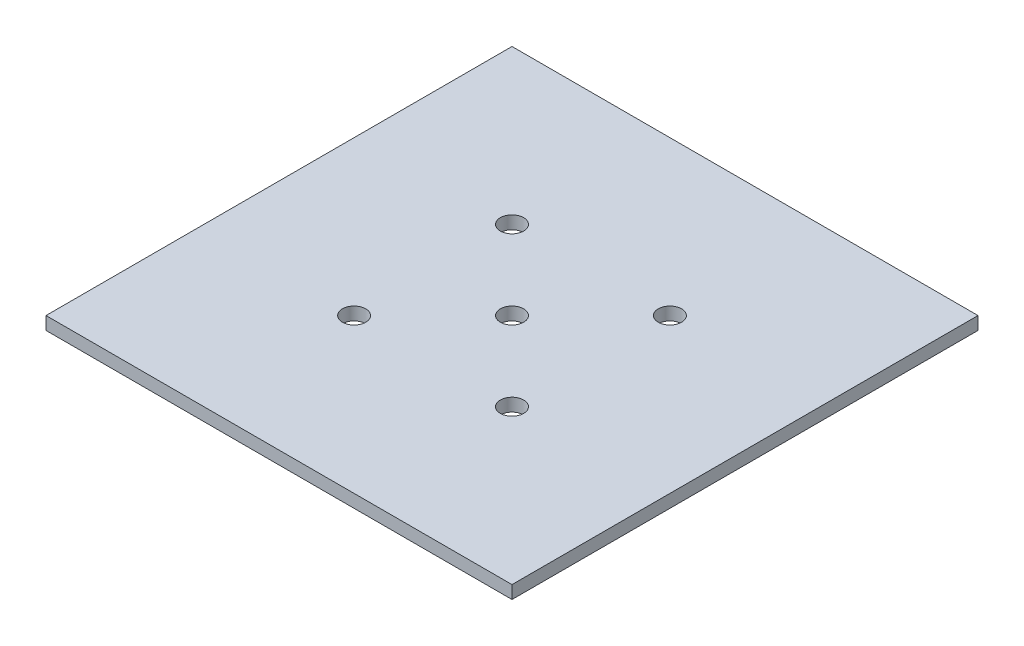
ISO-10303-21;
HEADER;
FILE_DESCRIPTION(('STEP AP214'),'2;1');
FILE_NAME('part.step','',(''),(''),'','','');
FILE_SCHEMA(('AUTOMOTIVE_DESIGN { 1 0 10303 214 1 1 1 1 }'));
ENDSEC;
DATA;
#1=APPLICATION_CONTEXT('core data for automotive mechanical design processes');
#2=APPLICATION_PROTOCOL_DEFINITION('international standard','automotive_design',2000,#1);
#3=PRODUCT_CONTEXT('',#1,'mechanical');
#4=PRODUCT('Part','Part','',(#3));
#5=PRODUCT_RELATED_PRODUCT_CATEGORY('part','',(#4));
#6=PRODUCT_DEFINITION_FORMATION('','',#4);
#7=PRODUCT_DEFINITION_CONTEXT('part definition',#1,'design');
#8=PRODUCT_DEFINITION('design','',#6,#7);
#9=PRODUCT_DEFINITION_SHAPE('','',#8);
#10=(LENGTH_UNIT() NAMED_UNIT(*) SI_UNIT(.MILLI.,.METRE.));
#11=(NAMED_UNIT(*) PLANE_ANGLE_UNIT() SI_UNIT($,.RADIAN.));
#12=(NAMED_UNIT(*) SI_UNIT($,.STERADIAN.) SOLID_ANGLE_UNIT());
#13=UNCERTAINTY_MEASURE_WITH_UNIT(LENGTH_MEASURE(1.E-05),#10,'distance_accuracy_value','');
#14=(GEOMETRIC_REPRESENTATION_CONTEXT(3) GLOBAL_UNCERTAINTY_ASSIGNED_CONTEXT((#13)) GLOBAL_UNIT_ASSIGNED_CONTEXT((#10,
#11,#12)) REPRESENTATION_CONTEXT('',''));
#15=CARTESIAN_POINT('',(0.,0.,0.));
#16=DIRECTION('',(0.,0.,1.));
#17=DIRECTION('',(1.,0.,0.));
#18=AXIS2_PLACEMENT_3D('',#15,#16,#17);
#19=CARTESIAN_POINT('',(45.,1.25,-45.));
#20=DIRECTION('',(-1.,0.,0.));
#21=DIRECTION('',(0.,0.,1.));
#22=AXIS2_PLACEMENT_3D('',#19,#20,#21);
#23=PLANE('',#22);
#24=DIRECTION('',(0.,0.,-1.));
#25=VECTOR('',#24,1.);
#26=CARTESIAN_POINT('',(45.,-1.25,-45.));
#27=LINE('',#26,#25);
#28=CARTESIAN_POINT('',(45.,-1.25,45.));
#29=VERTEX_POINT('',#28);
#30=CARTESIAN_POINT('',(45.,-1.25,-45.));
#31=VERTEX_POINT('',#30);
#32=EDGE_CURVE('E114',#29,#31,#27,.T.);
#33=ORIENTED_EDGE('',*,*,#32,.T.);
#34=DIRECTION('',(0.,-1.,0.));
#35=VECTOR('',#34,1.);
#36=CARTESIAN_POINT('',(45.,1.25,-45.));
#37=LINE('',#36,#35);
#38=CARTESIAN_POINT('',(45.,1.25,-45.));
#39=VERTEX_POINT('',#38);
#40=EDGE_CURVE('E11',#39,#31,#37,.T.);
#41=ORIENTED_EDGE('',*,*,#40,.F.);
#42=DIRECTION('',(0.,0.,-1.));
#43=VECTOR('',#42,1.);
#44=CARTESIAN_POINT('',(45.,1.25,-45.));
#45=LINE('',#44,#43);
#46=CARTESIAN_POINT('',(45.,1.25,45.));
#47=VERTEX_POINT('',#46);
#48=EDGE_CURVE('E97',#47,#39,#45,.T.);
#49=ORIENTED_EDGE('',*,*,#48,.F.);
#50=DIRECTION('',(0.,-1.,0.));
#51=VECTOR('',#50,1.);
#52=CARTESIAN_POINT('',(45.,1.25,45.));
#53=LINE('',#52,#51);
#54=EDGE_CURVE('E110',#47,#29,#53,.T.);
#55=ORIENTED_EDGE('',*,*,#54,.T.);
#56=EDGE_LOOP('',(#33,#41,#49,#55));
#57=FACE_BOUND('',#56,.T.);
#58=ADVANCED_FACE('F43',(#57),#23,.F.);
#59=CARTESIAN_POINT('',(-45.,1.25,-45.));
#60=DIRECTION('',(0.,0.,1.));
#61=DIRECTION('',(1.,0.,0.));
#62=AXIS2_PLACEMENT_3D('',#59,#60,#61);
#63=PLANE('',#62);
#64=DIRECTION('',(-1.,0.,0.));
#65=VECTOR('',#64,1.);
#66=CARTESIAN_POINT('',(-45.,-1.25,-45.));
#67=LINE('',#66,#65);
#68=CARTESIAN_POINT('',(-45.,-1.25,-45.));
#69=VERTEX_POINT('',#68);
#70=EDGE_CURVE('E102',#31,#69,#67,.T.);
#71=ORIENTED_EDGE('',*,*,#70,.T.);
#72=DIRECTION('',(0.,-1.,0.));
#73=VECTOR('',#72,1.);
#74=CARTESIAN_POINT('',(-45.,1.25,-45.));
#75=LINE('',#74,#73);
#76=CARTESIAN_POINT('',(-45.,1.25,-45.));
#77=VERTEX_POINT('',#76);
#78=EDGE_CURVE('E53',#77,#69,#75,.T.);
#79=ORIENTED_EDGE('',*,*,#78,.F.);
#80=DIRECTION('',(-1.,0.,0.));
#81=VECTOR('',#80,1.);
#82=CARTESIAN_POINT('',(-45.,1.25,-45.));
#83=LINE('',#82,#81);
#84=EDGE_CURVE('E92',#39,#77,#83,.T.);
#85=ORIENTED_EDGE('',*,*,#84,.F.);
#86=ORIENTED_EDGE('',*,*,#40,.T.);
#87=EDGE_LOOP('',(#71,#79,#85,#86));
#88=FACE_BOUND('',#87,.T.);
#89=ADVANCED_FACE('F101',(#88),#63,.F.);
#90=CARTESIAN_POINT('',(-45.,1.25,-45.));
#91=DIRECTION('',(1.,0.,0.));
#92=DIRECTION('',(0.,0.,-1.));
#93=AXIS2_PLACEMENT_3D('',#90,#91,#92);
#94=PLANE('',#93);
#95=DIRECTION('',(0.,0.,1.));
#96=VECTOR('',#95,1.);
#97=CARTESIAN_POINT('',(-45.,-1.25,-45.));
#98=LINE('',#97,#96);
#99=CARTESIAN_POINT('',(-45.,-1.25,45.));
#100=VERTEX_POINT('',#99);
#101=EDGE_CURVE('E79',#69,#100,#98,.T.);
#102=ORIENTED_EDGE('',*,*,#101,.T.);
#103=DIRECTION('',(0.,-1.,0.));
#104=VECTOR('',#103,1.);
#105=CARTESIAN_POINT('',(-45.,1.25,45.));
#106=LINE('',#105,#104);
#107=CARTESIAN_POINT('',(-45.,1.25,45.));
#108=VERTEX_POINT('',#107);
#109=EDGE_CURVE('E104',#108,#100,#106,.T.);
#110=ORIENTED_EDGE('',*,*,#109,.F.);
#111=DIRECTION('',(0.,0.,1.));
#112=VECTOR('',#111,1.);
#113=CARTESIAN_POINT('',(-45.,1.25,-45.));
#114=LINE('',#113,#112);
#115=EDGE_CURVE('E95',#77,#108,#114,.T.);
#116=ORIENTED_EDGE('',*,*,#115,.F.);
#117=ORIENTED_EDGE('',*,*,#78,.T.);
#118=EDGE_LOOP('',(#102,#110,#116,#117));
#119=FACE_BOUND('',#118,.T.);
#120=ADVANCED_FACE('F106',(#119),#94,.F.);
#121=CARTESIAN_POINT('',(-45.,1.25,45.));
#122=DIRECTION('',(0.,0.,-1.));
#123=DIRECTION('',(-1.,0.,0.));
#124=AXIS2_PLACEMENT_3D('',#121,#122,#123);
#125=PLANE('',#124);
#126=DIRECTION('',(1.,0.,0.));
#127=VECTOR('',#126,1.);
#128=CARTESIAN_POINT('',(-45.,-1.25,45.));
#129=LINE('',#128,#127);
#130=EDGE_CURVE('E85',#100,#29,#129,.T.);
#131=ORIENTED_EDGE('',*,*,#130,.T.);
#132=ORIENTED_EDGE('',*,*,#54,.F.);
#133=DIRECTION('',(1.,0.,0.));
#134=VECTOR('',#133,1.);
#135=CARTESIAN_POINT('',(-45.,1.25,45.));
#136=LINE('',#135,#134);
#137=EDGE_CURVE('E62',#108,#47,#136,.T.);
#138=ORIENTED_EDGE('',*,*,#137,.F.);
#139=ORIENTED_EDGE('',*,*,#109,.T.);
#140=EDGE_LOOP('',(#131,#132,#138,#139));
#141=FACE_BOUND('',#140,.T.);
#142=ADVANCED_FACE('F174',(#141),#125,.F.);
#143=CARTESIAN_POINT('',(0.,1.25,0.));
#144=DIRECTION('',(0.,1.,0.));
#145=DIRECTION('',(0.,0.,1.));
#146=AXIS2_PLACEMENT_3D('',#143,#144,#145);
#147=PLANE('',#146);
#148=CARTESIAN_POINT('',(0.,1.25,0.));
#149=DIRECTION('',(0.,1.,0.));
#150=DIRECTION('',(0.,0.,1.));
#151=AXIS2_PLACEMENT_3D('',#148,#149,#150);
#152=CIRCLE('',#151,2.24999999999999);
#153=CARTESIAN_POINT('',(0.,1.25,2.24999999999999));
#154=VERTEX_POINT('',#153);
#155=EDGE_CURVE('E158',#154,#154,#152,.T.);
#156=ORIENTED_EDGE('',*,*,#155,.F.);
#157=EDGE_LOOP('',(#156));
#158=FACE_BOUND('',#157,.T.);
#159=CARTESIAN_POINT('',(15.25,1.25,-15.25));
#160=DIRECTION('',(0.,1.,0.));
#161=DIRECTION('',(0.,0.,1.));
#162=AXIS2_PLACEMENT_3D('',#159,#160,#161);
#163=CIRCLE('',#162,2.24999999999999);
#164=CARTESIAN_POINT('',(15.25,1.25,-13.));
#165=VERTEX_POINT('',#164);
#166=EDGE_CURVE('E145',#165,#165,#163,.T.);
#167=ORIENTED_EDGE('',*,*,#166,.F.);
#168=EDGE_LOOP('',(#167));
#169=FACE_BOUND('',#168,.T.);
#170=CARTESIAN_POINT('',(-15.25,1.25,15.25));
#171=DIRECTION('',(0.,1.,0.));
#172=DIRECTION('',(0.,0.,1.));
#173=AXIS2_PLACEMENT_3D('',#170,#171,#172);
#174=CIRCLE('',#173,2.24999999999999);
#175=CARTESIAN_POINT('',(-15.25,1.25,17.5));
#176=VERTEX_POINT('',#175);
#177=EDGE_CURVE('E141',#176,#176,#174,.T.);
#178=ORIENTED_EDGE('',*,*,#177,.F.);
#179=EDGE_LOOP('',(#178));
#180=FACE_BOUND('',#179,.T.);
#181=CARTESIAN_POINT('',(-15.25,1.25,-15.25));
#182=DIRECTION('',(0.,1.,0.));
#183=DIRECTION('',(0.,0.,1.));
#184=AXIS2_PLACEMENT_3D('',#181,#182,#183);
#185=CIRCLE('',#184,2.24999999999999);
#186=CARTESIAN_POINT('',(-15.25,1.25,-13.));
#187=VERTEX_POINT('',#186);
#188=EDGE_CURVE('E137',#187,#187,#185,.T.);
#189=ORIENTED_EDGE('',*,*,#188,.F.);
#190=EDGE_LOOP('',(#189));
#191=FACE_BOUND('',#190,.T.);
#192=CARTESIAN_POINT('',(15.25,1.25,15.25));
#193=DIRECTION('',(0.,1.,0.));
#194=DIRECTION('',(0.,0.,1.));
#195=AXIS2_PLACEMENT_3D('',#192,#193,#194);
#196=CIRCLE('',#195,2.24999999999999);
#197=CARTESIAN_POINT('',(15.25,1.25,17.5));
#198=VERTEX_POINT('',#197);
#199=EDGE_CURVE('E132',#198,#198,#196,.T.);
#200=ORIENTED_EDGE('',*,*,#199,.F.);
#201=EDGE_LOOP('',(#200));
#202=FACE_BOUND('',#201,.T.);
#203=ORIENTED_EDGE('',*,*,#48,.T.);
#204=ORIENTED_EDGE('',*,*,#84,.T.);
#205=ORIENTED_EDGE('',*,*,#115,.T.);
#206=ORIENTED_EDGE('',*,*,#137,.T.);
#207=EDGE_LOOP('',(#203,#204,#205,#206));
#208=FACE_BOUND('',#207,.T.);
#209=ADVANCED_FACE('F93',(#158,#169,#180,#191,#202,#208),#147,.T.);
#210=CARTESIAN_POINT('',(0.,-1.25,0.));
#211=DIRECTION('',(0.,1.,0.));
#212=DIRECTION('',(0.,0.,1.));
#213=AXIS2_PLACEMENT_3D('',#210,#211,#212);
#214=PLANE('',#213);
#215=CARTESIAN_POINT('',(0.,-1.25,0.));
#216=DIRECTION('',(0.,1.,0.));
#217=DIRECTION('',(0.,0.,1.));
#218=AXIS2_PLACEMENT_3D('',#215,#216,#217);
#219=CIRCLE('',#218,2.24999999999999);
#220=CARTESIAN_POINT('',(0.,-1.25,2.24999999999999));
#221=VERTEX_POINT('',#220);
#222=EDGE_CURVE('E46',#221,#221,#219,.T.);
#223=ORIENTED_EDGE('',*,*,#222,.T.);
#224=EDGE_LOOP('',(#223));
#225=FACE_BOUND('',#224,.T.);
#226=CARTESIAN_POINT('',(15.25,-1.25,-15.25));
#227=DIRECTION('',(0.,1.,0.));
#228=DIRECTION('',(0.,0.,1.));
#229=AXIS2_PLACEMENT_3D('',#226,#227,#228);
#230=CIRCLE('',#229,2.24999999999999);
#231=CARTESIAN_POINT('',(15.25,-1.25,-13.));
#232=VERTEX_POINT('',#231);
#233=EDGE_CURVE('E142',#232,#232,#230,.T.);
#234=ORIENTED_EDGE('',*,*,#233,.T.);
#235=EDGE_LOOP('',(#234));
#236=FACE_BOUND('',#235,.T.);
#237=CARTESIAN_POINT('',(-15.25,-1.25,15.25));
#238=DIRECTION('',(0.,1.,0.));
#239=DIRECTION('',(0.,0.,1.));
#240=AXIS2_PLACEMENT_3D('',#237,#238,#239);
#241=CIRCLE('',#240,2.24999999999999);
#242=CARTESIAN_POINT('',(-15.25,-1.25,17.5));
#243=VERTEX_POINT('',#242);
#244=EDGE_CURVE('E138',#243,#243,#241,.T.);
#245=ORIENTED_EDGE('',*,*,#244,.T.);
#246=EDGE_LOOP('',(#245));
#247=FACE_BOUND('',#246,.T.);
#248=CARTESIAN_POINT('',(-15.25,-1.25,-15.25));
#249=DIRECTION('',(0.,1.,0.));
#250=DIRECTION('',(0.,0.,1.));
#251=AXIS2_PLACEMENT_3D('',#248,#249,#250);
#252=CIRCLE('',#251,2.24999999999999);
#253=CARTESIAN_POINT('',(-15.25,-1.25,-13.));
#254=VERTEX_POINT('',#253);
#255=EDGE_CURVE('E133',#254,#254,#252,.T.);
#256=ORIENTED_EDGE('',*,*,#255,.T.);
#257=EDGE_LOOP('',(#256));
#258=FACE_BOUND('',#257,.T.);
#259=CARTESIAN_POINT('',(15.25,-1.25,15.25));
#260=DIRECTION('',(0.,1.,0.));
#261=DIRECTION('',(0.,0.,1.));
#262=AXIS2_PLACEMENT_3D('',#259,#260,#261);
#263=CIRCLE('',#262,2.24999999999999);
#264=CARTESIAN_POINT('',(15.25,-1.25,17.5));
#265=VERTEX_POINT('',#264);
#266=EDGE_CURVE('E118',#265,#265,#263,.T.);
#267=ORIENTED_EDGE('',*,*,#266,.T.);
#268=EDGE_LOOP('',(#267));
#269=FACE_BOUND('',#268,.T.);
#270=ORIENTED_EDGE('',*,*,#32,.F.);
#271=ORIENTED_EDGE('',*,*,#130,.F.);
#272=ORIENTED_EDGE('',*,*,#101,.F.);
#273=ORIENTED_EDGE('',*,*,#70,.F.);
#274=EDGE_LOOP('',(#270,#271,#272,#273));
#275=FACE_BOUND('',#274,.T.);
#276=ADVANCED_FACE('F173',(#225,#236,#247,#258,#269,#275),#214,.F.);
#277=CARTESIAN_POINT('',(15.25,1.25,15.25));
#278=DIRECTION('',(0.,1.,0.));
#279=DIRECTION('',(0.,0.,1.));
#280=AXIS2_PLACEMENT_3D('',#277,#278,#279);
#281=CYLINDRICAL_SURFACE('',#280,2.24999999999999);
#282=ORIENTED_EDGE('',*,*,#199,.T.);
#283=EDGE_LOOP('',(#282));
#284=FACE_BOUND('',#283,.T.);
#285=ORIENTED_EDGE('',*,*,#266,.F.);
#286=EDGE_LOOP('',(#285));
#287=FACE_BOUND('',#286,.T.);
#288=ADVANCED_FACE('F169',(#284,#287),#281,.F.);
#289=CARTESIAN_POINT('',(-15.25,1.25,-15.25));
#290=DIRECTION('',(0.,1.,0.));
#291=DIRECTION('',(0.,0.,1.));
#292=AXIS2_PLACEMENT_3D('',#289,#290,#291);
#293=CYLINDRICAL_SURFACE('',#292,2.24999999999999);
#294=ORIENTED_EDGE('',*,*,#188,.T.);
#295=EDGE_LOOP('',(#294));
#296=FACE_BOUND('',#295,.T.);
#297=ORIENTED_EDGE('',*,*,#255,.F.);
#298=EDGE_LOOP('',(#297));
#299=FACE_BOUND('',#298,.T.);
#300=ADVANCED_FACE('F223',(#296,#299),#293,.F.);
#301=CARTESIAN_POINT('',(-15.25,1.25,15.25));
#302=DIRECTION('',(0.,1.,0.));
#303=DIRECTION('',(0.,0.,1.));
#304=AXIS2_PLACEMENT_3D('',#301,#302,#303);
#305=CYLINDRICAL_SURFACE('',#304,2.24999999999999);
#306=ORIENTED_EDGE('',*,*,#177,.T.);
#307=EDGE_LOOP('',(#306));
#308=FACE_BOUND('',#307,.T.);
#309=ORIENTED_EDGE('',*,*,#244,.F.);
#310=EDGE_LOOP('',(#309));
#311=FACE_BOUND('',#310,.T.);
#312=ADVANCED_FACE('F228',(#308,#311),#305,.F.);
#313=CARTESIAN_POINT('',(15.25,1.25,-15.25));
#314=DIRECTION('',(0.,1.,0.));
#315=DIRECTION('',(0.,0.,1.));
#316=AXIS2_PLACEMENT_3D('',#313,#314,#315);
#317=CYLINDRICAL_SURFACE('',#316,2.24999999999999);
#318=ORIENTED_EDGE('',*,*,#166,.T.);
#319=EDGE_LOOP('',(#318));
#320=FACE_BOUND('',#319,.T.);
#321=ORIENTED_EDGE('',*,*,#233,.F.);
#322=EDGE_LOOP('',(#321));
#323=FACE_BOUND('',#322,.T.);
#324=ADVANCED_FACE('F236',(#320,#323),#317,.F.);
#325=CARTESIAN_POINT('',(0.,1.25,0.));
#326=DIRECTION('',(0.,1.,0.));
#327=DIRECTION('',(0.,0.,1.));
#328=AXIS2_PLACEMENT_3D('',#325,#326,#327);
#329=CYLINDRICAL_SURFACE('',#328,2.24999999999999);
#330=ORIENTED_EDGE('',*,*,#155,.T.);
#331=EDGE_LOOP('',(#330));
#332=FACE_BOUND('',#331,.T.);
#333=ORIENTED_EDGE('',*,*,#222,.F.);
#334=EDGE_LOOP('',(#333));
#335=FACE_BOUND('',#334,.T.);
#336=ADVANCED_FACE('F244',(#332,#335),#329,.F.);
#337=CLOSED_SHELL('',(#58,#89,#120,#142,#209,#276,#288,#300,#312,#324,#336));
#338=MANIFOLD_SOLID_BREP('B2',#337);
#339=ADVANCED_BREP_SHAPE_REPRESENTATION('',(#18,#338),#14);
#340=SHAPE_DEFINITION_REPRESENTATION(#9,#339);
ENDSEC;
END-ISO-10303-21;
